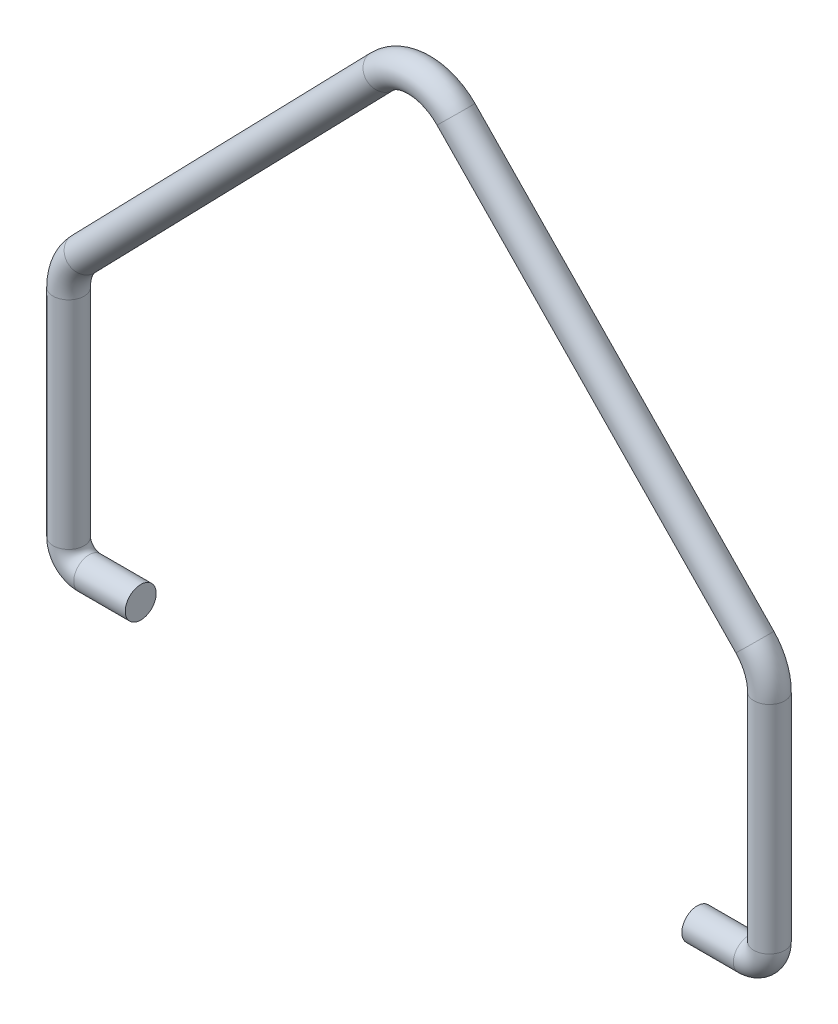
ISO-10303-21;
HEADER;
FILE_DESCRIPTION(('STEP AP214'),'2;1');
FILE_NAME('part.step','',(''),(''),'','','');
FILE_SCHEMA(('AUTOMOTIVE_DESIGN { 1 0 10303 214 1 1 1 1 }'));
ENDSEC;
DATA;
#1=APPLICATION_CONTEXT('core data for automotive mechanical design processes');
#2=APPLICATION_PROTOCOL_DEFINITION('international standard','automotive_design',2000,#1);
#3=PRODUCT_CONTEXT('',#1,'mechanical');
#4=PRODUCT('Part','Part','',(#3));
#5=PRODUCT_RELATED_PRODUCT_CATEGORY('part','',(#4));
#6=PRODUCT_DEFINITION_FORMATION('','',#4);
#7=PRODUCT_DEFINITION_CONTEXT('part definition',#1,'design');
#8=PRODUCT_DEFINITION('design','',#6,#7);
#9=PRODUCT_DEFINITION_SHAPE('','',#8);
#10=(LENGTH_UNIT() NAMED_UNIT(*) SI_UNIT(.MILLI.,.METRE.));
#11=(NAMED_UNIT(*) PLANE_ANGLE_UNIT() SI_UNIT($,.RADIAN.));
#12=(NAMED_UNIT(*) SI_UNIT($,.STERADIAN.) SOLID_ANGLE_UNIT());
#13=UNCERTAINTY_MEASURE_WITH_UNIT(LENGTH_MEASURE(1.E-05),#10,'distance_accuracy_value','');
#14=(GEOMETRIC_REPRESENTATION_CONTEXT(3) GLOBAL_UNCERTAINTY_ASSIGNED_CONTEXT((#13)) GLOBAL_UNIT_ASSIGNED_CONTEXT((#10,
#11,#12)) REPRESENTATION_CONTEXT('',''));
#15=CARTESIAN_POINT('',(0.,0.,0.));
#16=DIRECTION('',(0.,0.,1.));
#17=DIRECTION('',(1.,0.,0.));
#18=AXIS2_PLACEMENT_3D('',#15,#16,#17);
#19=CARTESIAN_POINT('',(27.,0.,0.));
#20=DIRECTION('',(-1.,0.,0.));
#21=DIRECTION('',(0.,0.,1.));
#22=AXIS2_PLACEMENT_3D('',#19,#20,#21);
#23=PLANE('',#22);
#24=CARTESIAN_POINT('',(27.,0.,0.));
#25=DIRECTION('',(-1.,0.,0.));
#26=DIRECTION('',(0.,0.,1.));
#27=AXIS2_PLACEMENT_3D('',#24,#25,#26);
#28=CIRCLE('',#27,1.5);
#29=CARTESIAN_POINT('',(27.,0.,1.5));
#30=VERTEX_POINT('',#29);
#31=EDGE_CURVE('E83',#30,#30,#28,.T.);
#32=ORIENTED_EDGE('',*,*,#31,.T.);
#33=EDGE_LOOP('',(#32));
#34=FACE_BOUND('',#33,.T.);
#35=ADVANCED_FACE('F43',(#34),#23,.T.);
#36=CARTESIAN_POINT('',(-27.,0.,0.));
#37=DIRECTION('',(-1.,0.,0.));
#38=DIRECTION('',(0.,0.,1.));
#39=AXIS2_PLACEMENT_3D('',#36,#37,#38);
#40=PLANE('',#39);
#41=CARTESIAN_POINT('',(-27.,0.,0.));
#42=DIRECTION('',(-1.,0.,0.));
#43=DIRECTION('',(0.,0.,1.));
#44=AXIS2_PLACEMENT_3D('',#41,#42,#43);
#45=CIRCLE('',#44,1.5);
#46=CARTESIAN_POINT('',(-27.,0.,1.5));
#47=VERTEX_POINT('',#46);
#48=EDGE_CURVE('E11',#47,#47,#45,.T.);
#49=ORIENTED_EDGE('',*,*,#48,.F.);
#50=EDGE_LOOP('',(#49));
#51=FACE_BOUND('',#50,.T.);
#52=ADVANCED_FACE('F91',(#51),#40,.F.);
#53=CARTESIAN_POINT('',(27.,0.,0.));
#54=DIRECTION('',(1.,0.,0.));
#55=DIRECTION('',(0.,0.,-1.));
#56=AXIS2_PLACEMENT_3D('',#53,#54,#55);
#57=CYLINDRICAL_SURFACE('',#56,1.5);
#58=CARTESIAN_POINT('',(32.,0.,0.));
#59=DIRECTION('',(-1.,0.,0.));
#60=DIRECTION('',(0.,0.,1.));
#61=AXIS2_PLACEMENT_3D('',#58,#59,#60);
#62=CIRCLE('',#61,1.5);
#63=CARTESIAN_POINT('',(32.,-1.5,0.));
#64=VERTEX_POINT('',#63);
#65=EDGE_CURVE('E80',#64,#64,#62,.T.);
#66=ORIENTED_EDGE('',*,*,#65,.T.);
#67=EDGE_LOOP('',(#66));
#68=FACE_BOUND('',#67,.T.);
#69=ORIENTED_EDGE('',*,*,#31,.F.);
#70=EDGE_LOOP('',(#69));
#71=FACE_BOUND('',#70,.T.);
#72=ADVANCED_FACE('F88',(#68,#71),#57,.T.);
#73=CARTESIAN_POINT('',(32.,2.,0.));
#74=DIRECTION('',(0.,0.,1.));
#75=DIRECTION('',(1.,0.,0.));
#76=AXIS2_PLACEMENT_3D('',#73,#74,#75);
#77=TOROIDAL_SURFACE('',#76,2.,1.5);
#78=CARTESIAN_POINT('',(34.,2.,0.));
#79=DIRECTION('',(0.,-1.,0.));
#80=DIRECTION('',(0.,0.,1.));
#81=AXIS2_PLACEMENT_3D('',#78,#79,#80);
#82=CIRCLE('',#81,1.5);
#83=CARTESIAN_POINT('',(35.5,2.,0.));
#84=VERTEX_POINT('',#83);
#85=EDGE_CURVE('E77',#84,#84,#82,.T.);
#86=CARTESIAN_POINT('',(32.,2.,0.));
#87=DIRECTION('',(0.,0.,1.));
#88=DIRECTION('',(1.,0.,0.));
#89=AXIS2_PLACEMENT_3D('',#86,#87,#88);
#90=CIRCLE('',#89,3.5);
#91=EDGE_CURVE('',#64,#84,#90,.T.);
#92=ORIENTED_EDGE('',*,*,#65,.F.);
#93=ORIENTED_EDGE('',*,*,#85,.T.);
#94=ORIENTED_EDGE('',*,*,#91,.T.);
#95=ORIENTED_EDGE('',*,*,#91,.F.);
#96=EDGE_LOOP('',(#92,#94,#93,#95));
#97=FACE_BOUND('',#96,.T.);
#98=ADVANCED_FACE('F90',(#97),#77,.T.);
#99=CARTESIAN_POINT('',(34.,2.,0.));
#100=DIRECTION('',(0.,1.,0.));
#101=DIRECTION('',(0.,0.,1.));
#102=AXIS2_PLACEMENT_3D('',#99,#100,#101);
#103=CYLINDRICAL_SURFACE('',#102,1.5);
#104=CARTESIAN_POINT('',(34.,22.9712512360259,0.));
#105=DIRECTION('',(0.,-1.,0.));
#106=DIRECTION('',(0.,0.,1.));
#107=AXIS2_PLACEMENT_3D('',#104,#105,#106);
#108=CIRCLE('',#107,1.5);
#109=CARTESIAN_POINT('',(35.5,22.9712512360259,0.));
#110=VERTEX_POINT('',#109);
#111=EDGE_CURVE('E74',#110,#110,#108,.T.);
#112=ORIENTED_EDGE('',*,*,#111,.T.);
#113=EDGE_LOOP('',(#112));
#114=FACE_BOUND('',#113,.T.);
#115=ORIENTED_EDGE('',*,*,#85,.F.);
#116=EDGE_LOOP('',(#115));
#117=FACE_BOUND('',#116,.T.);
#118=ADVANCED_FACE('F98',(#114,#117),#103,.T.);
#119=CARTESIAN_POINT('',(29.,22.9712512360259,0.));
#120=DIRECTION('',(0.,0.,1.));
#121=DIRECTION('',(1.,0.,0.));
#122=AXIS2_PLACEMENT_3D('',#119,#120,#121);
#123=TOROIDAL_SURFACE('',#122,5.,1.5);
#124=CARTESIAN_POINT('',(32.5863969042961,26.4551796573422,0.));
#125=DIRECTION('',(0.696785684263249,-0.717279380859227,0.));
#126=DIRECTION('',(0.,0.,1.));
#127=AXIS2_PLACEMENT_3D('',#124,#125,#126);
#128=CIRCLE('',#127,1.5);
#129=CARTESIAN_POINT('',(33.662315975585,27.5003581837371,0.));
#130=VERTEX_POINT('',#129);
#131=EDGE_CURVE('E71',#130,#130,#128,.T.);
#132=CARTESIAN_POINT('',(29.,22.9712512360259,0.));
#133=DIRECTION('',(0.,0.,1.));
#134=DIRECTION('',(1.,0.,0.));
#135=AXIS2_PLACEMENT_3D('',#132,#133,#134);
#136=CIRCLE('',#135,6.5);
#137=EDGE_CURVE('',#110,#130,#136,.T.);
#138=ORIENTED_EDGE('',*,*,#111,.F.);
#139=ORIENTED_EDGE('',*,*,#131,.T.);
#140=ORIENTED_EDGE('',*,*,#137,.T.);
#141=ORIENTED_EDGE('',*,*,#137,.F.);
#142=EDGE_LOOP('',(#138,#140,#139,#141));
#143=FACE_BOUND('',#142,.T.);
#144=ADVANCED_FACE('F131',(#143),#123,.T.);
#145=CARTESIAN_POINT('',(32.5863969042961,26.4551796573422,0.));
#146=DIRECTION('',(-0.696785684263249,0.717279380859227,0.));
#147=DIRECTION('',(-0.717279380859227,-0.696785684263249,0.));
#148=AXIS2_PLACEMENT_3D('',#145,#146,#147);
#149=CYLINDRICAL_SURFACE('',#148,1.5);
#150=CARTESIAN_POINT('',(3.58639690429614,56.3081208338128,0.));
#151=DIRECTION('',(0.696785684263249,-0.717279380859227,0.));
#152=DIRECTION('',(0.,0.,1.));
#153=AXIS2_PLACEMENT_3D('',#150,#151,#152);
#154=CIRCLE('',#153,1.5);
#155=CARTESIAN_POINT('',(4.66231597558498,57.3532993602077,0.));
#156=VERTEX_POINT('',#155);
#157=EDGE_CURVE('E68',#156,#156,#154,.T.);
#158=ORIENTED_EDGE('',*,*,#157,.T.);
#159=EDGE_LOOP('',(#158));
#160=FACE_BOUND('',#159,.T.);
#161=ORIENTED_EDGE('',*,*,#131,.F.);
#162=EDGE_LOOP('',(#161));
#163=FACE_BOUND('',#162,.T.);
#164=ADVANCED_FACE('F127',(#160,#163),#149,.T.);
#165=CARTESIAN_POINT('',(0.,52.8241924124965,0.));
#166=DIRECTION('',(0.,0.,1.));
#167=DIRECTION('',(1.,0.,0.));
#168=AXIS2_PLACEMENT_3D('',#165,#166,#167);
#169=TOROIDAL_SURFACE('',#168,5.00000000000001,1.5);
#170=CARTESIAN_POINT('',(-3.58639690429614,56.3081208338128,0.));
#171=DIRECTION('',(0.696785684263249,0.717279380859226,0.));
#172=DIRECTION('',(0.,0.,1.));
#173=AXIS2_PLACEMENT_3D('',#170,#171,#172);
#174=CIRCLE('',#173,1.5);
#175=CARTESIAN_POINT('',(-4.66231597558498,57.3532993602077,0.));
#176=VERTEX_POINT('',#175);
#177=EDGE_CURVE('E65',#176,#176,#174,.T.);
#178=CARTESIAN_POINT('',(0.,52.8241924124965,0.));
#179=DIRECTION('',(0.,0.,1.));
#180=DIRECTION('',(1.,0.,0.));
#181=AXIS2_PLACEMENT_3D('',#178,#179,#180);
#182=CIRCLE('',#181,6.50000000000001);
#183=EDGE_CURVE('',#156,#176,#182,.T.);
#184=ORIENTED_EDGE('',*,*,#157,.F.);
#185=ORIENTED_EDGE('',*,*,#177,.T.);
#186=ORIENTED_EDGE('',*,*,#183,.T.);
#187=ORIENTED_EDGE('',*,*,#183,.F.);
#188=EDGE_LOOP('',(#184,#186,#185,#187));
#189=FACE_BOUND('',#188,.T.);
#190=ADVANCED_FACE('F123',(#189),#169,.T.);
#191=CARTESIAN_POINT('',(-3.58639690429614,56.3081208338128,0.));
#192=DIRECTION('',(-0.696785684263249,-0.717279380859227,0.));
#193=DIRECTION('',(0.717279380859227,-0.696785684263249,0.));
#194=AXIS2_PLACEMENT_3D('',#191,#192,#193);
#195=CYLINDRICAL_SURFACE('',#194,1.5);
#196=CARTESIAN_POINT('',(-32.5863969042961,26.4551796573422,0.));
#197=DIRECTION('',(0.696785684263249,0.717279380859227,0.));
#198=DIRECTION('',(0.,0.,1.));
#199=AXIS2_PLACEMENT_3D('',#196,#197,#198);
#200=CIRCLE('',#199,1.5);
#201=CARTESIAN_POINT('',(-33.662315975585,27.5003581837371,0.));
#202=VERTEX_POINT('',#201);
#203=EDGE_CURVE('E62',#202,#202,#200,.T.);
#204=ORIENTED_EDGE('',*,*,#203,.T.);
#205=EDGE_LOOP('',(#204));
#206=FACE_BOUND('',#205,.T.);
#207=ORIENTED_EDGE('',*,*,#177,.F.);
#208=EDGE_LOOP('',(#207));
#209=FACE_BOUND('',#208,.T.);
#210=ADVANCED_FACE('F119',(#206,#209),#195,.T.);
#211=CARTESIAN_POINT('',(-29.,22.9712512360259,0.));
#212=DIRECTION('',(0.,0.,1.));
#213=DIRECTION('',(1.,0.,0.));
#214=AXIS2_PLACEMENT_3D('',#211,#212,#213);
#215=TOROIDAL_SURFACE('',#214,5.00000000000001,1.5);
#216=CARTESIAN_POINT('',(-34.,22.9712512360259,0.));
#217=DIRECTION('',(0.,1.,0.));
#218=DIRECTION('',(0.,0.,1.));
#219=AXIS2_PLACEMENT_3D('',#216,#217,#218);
#220=CIRCLE('',#219,1.5);
#221=CARTESIAN_POINT('',(-35.5,22.9712512360259,0.));
#222=VERTEX_POINT('',#221);
#223=EDGE_CURVE('E57',#222,#222,#220,.T.);
#224=CARTESIAN_POINT('',(-29.,22.9712512360259,0.));
#225=DIRECTION('',(0.,0.,1.));
#226=DIRECTION('',(1.,0.,0.));
#227=AXIS2_PLACEMENT_3D('',#224,#225,#226);
#228=CIRCLE('',#227,6.50000000000001);
#229=EDGE_CURVE('',#202,#222,#228,.T.);
#230=ORIENTED_EDGE('',*,*,#203,.F.);
#231=ORIENTED_EDGE('',*,*,#223,.T.);
#232=ORIENTED_EDGE('',*,*,#229,.T.);
#233=ORIENTED_EDGE('',*,*,#229,.F.);
#234=EDGE_LOOP('',(#230,#232,#231,#233));
#235=FACE_BOUND('',#234,.T.);
#236=ADVANCED_FACE('F115',(#235),#215,.T.);
#237=CARTESIAN_POINT('',(-34.,22.9712512360259,0.));
#238=DIRECTION('',(0.,-1.,0.));
#239=DIRECTION('',(0.,0.,-1.));
#240=AXIS2_PLACEMENT_3D('',#237,#238,#239);
#241=CYLINDRICAL_SURFACE('',#240,1.5);
#242=CARTESIAN_POINT('',(-34.,2.,0.));
#243=DIRECTION('',(0.,1.,0.));
#244=DIRECTION('',(0.,0.,1.));
#245=AXIS2_PLACEMENT_3D('',#242,#243,#244);
#246=CIRCLE('',#245,1.5);
#247=CARTESIAN_POINT('',(-35.5,2.,0.));
#248=VERTEX_POINT('',#247);
#249=EDGE_CURVE('E53',#248,#248,#246,.T.);
#250=ORIENTED_EDGE('',*,*,#249,.T.);
#251=EDGE_LOOP('',(#250));
#252=FACE_BOUND('',#251,.T.);
#253=ORIENTED_EDGE('',*,*,#223,.F.);
#254=EDGE_LOOP('',(#253));
#255=FACE_BOUND('',#254,.T.);
#256=ADVANCED_FACE('F109',(#252,#255),#241,.T.);
#257=CARTESIAN_POINT('',(-32.,2.,0.));
#258=DIRECTION('',(0.,0.,1.));
#259=DIRECTION('',(1.,0.,0.));
#260=AXIS2_PLACEMENT_3D('',#257,#258,#259);
#261=TOROIDAL_SURFACE('',#260,2.,1.5);
#262=CARTESIAN_POINT('',(-32.,0.,0.));
#263=DIRECTION('',(-1.,0.,0.));
#264=DIRECTION('',(0.,0.,1.));
#265=AXIS2_PLACEMENT_3D('',#262,#263,#264);
#266=CIRCLE('',#265,1.5);
#267=CARTESIAN_POINT('',(-32.,-1.5,0.));
#268=VERTEX_POINT('',#267);
#269=EDGE_CURVE('E49',#268,#268,#266,.T.);
#270=CARTESIAN_POINT('',(-32.,2.,0.));
#271=DIRECTION('',(0.,0.,1.));
#272=DIRECTION('',(1.,0.,0.));
#273=AXIS2_PLACEMENT_3D('',#270,#271,#272);
#274=CIRCLE('',#273,3.5);
#275=EDGE_CURVE('',#248,#268,#274,.T.);
#276=ORIENTED_EDGE('',*,*,#249,.F.);
#277=ORIENTED_EDGE('',*,*,#269,.T.);
#278=ORIENTED_EDGE('',*,*,#275,.T.);
#279=ORIENTED_EDGE('',*,*,#275,.F.);
#280=EDGE_LOOP('',(#276,#278,#277,#279));
#281=FACE_BOUND('',#280,.T.);
#282=ADVANCED_FACE('F104',(#281),#261,.T.);
#283=CARTESIAN_POINT('',(-32.,0.,0.));
#284=DIRECTION('',(1.,0.,0.));
#285=DIRECTION('',(0.,0.,-1.));
#286=AXIS2_PLACEMENT_3D('',#283,#284,#285);
#287=CYLINDRICAL_SURFACE('',#286,1.5);
#288=ORIENTED_EDGE('',*,*,#48,.T.);
#289=EDGE_LOOP('',(#288));
#290=FACE_BOUND('',#289,.T.);
#291=ORIENTED_EDGE('',*,*,#269,.F.);
#292=EDGE_LOOP('',(#291));
#293=FACE_BOUND('',#292,.T.);
#294=ADVANCED_FACE('F102',(#290,#293),#287,.T.);
#295=CLOSED_SHELL('',(#35,#52,#72,#98,#118,#144,#164,#190,#210,#236,#256,#282,#294));
#296=MANIFOLD_SOLID_BREP('B2',#295);
#297=ADVANCED_BREP_SHAPE_REPRESENTATION('',(#18,#296),#14);
#298=SHAPE_DEFINITION_REPRESENTATION(#9,#297);
ENDSEC;
END-ISO-10303-21;
